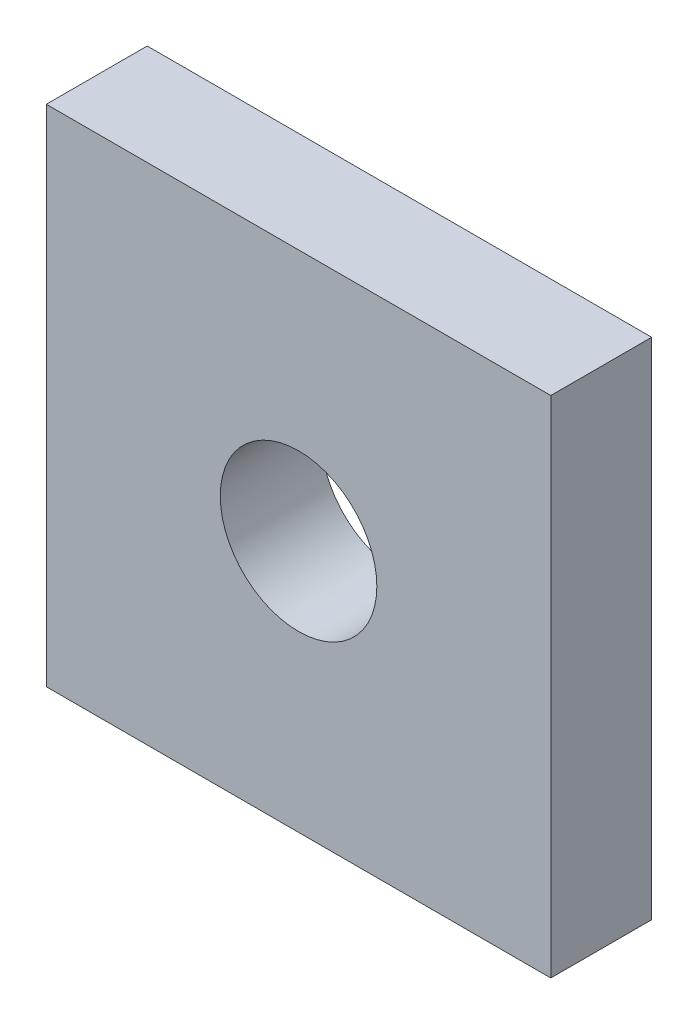
ISO-10303-21;
HEADER;
FILE_DESCRIPTION(('STEP AP214'),'2;1');
FILE_NAME('part.step','',(''),(''),'','','');
FILE_SCHEMA(('AUTOMOTIVE_DESIGN { 1 0 10303 214 1 1 1 1 }'));
ENDSEC;
DATA;
#1=APPLICATION_CONTEXT('core data for automotive mechanical design processes');
#2=APPLICATION_PROTOCOL_DEFINITION('international standard','automotive_design',2000,#1);
#3=PRODUCT_CONTEXT('',#1,'mechanical');
#4=PRODUCT('Part','Part','',(#3));
#5=PRODUCT_RELATED_PRODUCT_CATEGORY('part','',(#4));
#6=PRODUCT_DEFINITION_FORMATION('','',#4);
#7=PRODUCT_DEFINITION_CONTEXT('part definition',#1,'design');
#8=PRODUCT_DEFINITION('design','',#6,#7);
#9=PRODUCT_DEFINITION_SHAPE('','',#8);
#10=(LENGTH_UNIT() NAMED_UNIT(*) SI_UNIT(.MILLI.,.METRE.));
#11=(NAMED_UNIT(*) PLANE_ANGLE_UNIT() SI_UNIT($,.RADIAN.));
#12=(NAMED_UNIT(*) SI_UNIT($,.STERADIAN.) SOLID_ANGLE_UNIT());
#13=UNCERTAINTY_MEASURE_WITH_UNIT(LENGTH_MEASURE(1.E-05),#10,'distance_accuracy_value','');
#14=(GEOMETRIC_REPRESENTATION_CONTEXT(3) GLOBAL_UNCERTAINTY_ASSIGNED_CONTEXT((#13)) GLOBAL_UNIT_ASSIGNED_CONTEXT((#10,
#11,#12)) REPRESENTATION_CONTEXT('',''));
#15=CARTESIAN_POINT('',(0.,0.,0.));
#16=DIRECTION('',(0.,0.,1.));
#17=DIRECTION('',(1.,0.,0.));
#18=AXIS2_PLACEMENT_3D('',#15,#16,#17);
#19=CARTESIAN_POINT('',(-175.,-175.,70.));
#20=DIRECTION('',(1.,0.,0.));
#21=DIRECTION('',(0.,0.,-1.));
#22=AXIS2_PLACEMENT_3D('',#19,#20,#21);
#23=PLANE('',#22);
#24=DIRECTION('',(0.,-1.,0.));
#25=VECTOR('',#24,1.);
#26=CARTESIAN_POINT('',(-175.,-175.,0.));
#27=LINE('',#26,#25);
#28=CARTESIAN_POINT('',(-175.,175.,0.));
#29=VERTEX_POINT('',#28);
#30=CARTESIAN_POINT('',(-175.,-175.,0.));
#31=VERTEX_POINT('',#30);
#32=EDGE_CURVE('E119',#29,#31,#27,.T.);
#33=ORIENTED_EDGE('',*,*,#32,.T.);
#34=DIRECTION('',(0.,0.,-1.));
#35=VECTOR('',#34,1.);
#36=CARTESIAN_POINT('',(-175.,-175.,70.));
#37=LINE('',#36,#35);
#38=CARTESIAN_POINT('',(-175.,-175.,70.));
#39=VERTEX_POINT('',#38);
#40=EDGE_CURVE('E13',#39,#31,#37,.T.);
#41=ORIENTED_EDGE('',*,*,#40,.F.);
#42=DIRECTION('',(0.,-1.,0.));
#43=VECTOR('',#42,1.);
#44=CARTESIAN_POINT('',(-175.,-175.,70.));
#45=LINE('',#44,#43);
#46=CARTESIAN_POINT('',(-175.,175.,70.));
#47=VERTEX_POINT('',#46);
#48=EDGE_CURVE('E103',#47,#39,#45,.T.);
#49=ORIENTED_EDGE('',*,*,#48,.F.);
#50=DIRECTION('',(0.,0.,-1.));
#51=VECTOR('',#50,1.);
#52=CARTESIAN_POINT('',(-175.,175.,70.));
#53=LINE('',#52,#51);
#54=EDGE_CURVE('E115',#47,#29,#53,.T.);
#55=ORIENTED_EDGE('',*,*,#54,.T.);
#56=EDGE_LOOP('',(#33,#41,#49,#55));
#57=FACE_BOUND('',#56,.T.);
#58=ADVANCED_FACE('F51',(#57),#23,.F.);
#59=CARTESIAN_POINT('',(175.,-175.,70.));
#60=DIRECTION('',(0.,1.,0.));
#61=DIRECTION('',(-1.,0.,0.));
#62=AXIS2_PLACEMENT_3D('',#59,#60,#61);
#63=PLANE('',#62);
#64=DIRECTION('',(1.,0.,0.));
#65=VECTOR('',#64,1.);
#66=CARTESIAN_POINT('',(175.,-175.,0.));
#67=LINE('',#66,#65);
#68=CARTESIAN_POINT('',(175.,-175.,0.));
#69=VERTEX_POINT('',#68);
#70=EDGE_CURVE('E108',#31,#69,#67,.T.);
#71=ORIENTED_EDGE('',*,*,#70,.T.);
#72=DIRECTION('',(0.,0.,-1.));
#73=VECTOR('',#72,1.);
#74=CARTESIAN_POINT('',(175.,-175.,70.));
#75=LINE('',#74,#73);
#76=CARTESIAN_POINT('',(175.,-175.,70.));
#77=VERTEX_POINT('',#76);
#78=EDGE_CURVE('E60',#77,#69,#75,.T.);
#79=ORIENTED_EDGE('',*,*,#78,.F.);
#80=DIRECTION('',(1.,0.,0.));
#81=VECTOR('',#80,1.);
#82=CARTESIAN_POINT('',(175.,-175.,70.));
#83=LINE('',#82,#81);
#84=EDGE_CURVE('E98',#39,#77,#83,.T.);
#85=ORIENTED_EDGE('',*,*,#84,.F.);
#86=ORIENTED_EDGE('',*,*,#40,.T.);
#87=EDGE_LOOP('',(#71,#79,#85,#86));
#88=FACE_BOUND('',#87,.T.);
#89=ADVANCED_FACE('F107',(#88),#63,.F.);
#90=CARTESIAN_POINT('',(175.,-175.,70.));
#91=DIRECTION('',(-1.,0.,0.));
#92=DIRECTION('',(0.,0.,1.));
#93=AXIS2_PLACEMENT_3D('',#90,#91,#92);
#94=PLANE('',#93);
#95=DIRECTION('',(0.,1.,0.));
#96=VECTOR('',#95,1.);
#97=CARTESIAN_POINT('',(175.,-175.,0.));
#98=LINE('',#97,#96);
#99=CARTESIAN_POINT('',(175.,175.,0.));
#100=VERTEX_POINT('',#99);
#101=EDGE_CURVE('E85',#69,#100,#98,.T.);
#102=ORIENTED_EDGE('',*,*,#101,.T.);
#103=DIRECTION('',(0.,0.,-1.));
#104=VECTOR('',#103,1.);
#105=CARTESIAN_POINT('',(175.,175.,70.));
#106=LINE('',#105,#104);
#107=CARTESIAN_POINT('',(175.,175.,70.));
#108=VERTEX_POINT('',#107);
#109=EDGE_CURVE('E110',#108,#100,#106,.T.);
#110=ORIENTED_EDGE('',*,*,#109,.F.);
#111=DIRECTION('',(0.,1.,0.));
#112=VECTOR('',#111,1.);
#113=CARTESIAN_POINT('',(175.,-175.,70.));
#114=LINE('',#113,#112);
#115=EDGE_CURVE('E101',#77,#108,#114,.T.);
#116=ORIENTED_EDGE('',*,*,#115,.F.);
#117=ORIENTED_EDGE('',*,*,#78,.T.);
#118=EDGE_LOOP('',(#102,#110,#116,#117));
#119=FACE_BOUND('',#118,.T.);
#120=ADVANCED_FACE('F111',(#119),#94,.F.);
#121=CARTESIAN_POINT('',(175.,175.,70.));
#122=DIRECTION('',(0.,-1.,0.));
#123=DIRECTION('',(1.,0.,0.));
#124=AXIS2_PLACEMENT_3D('',#121,#122,#123);
#125=PLANE('',#124);
#126=DIRECTION('',(-1.,0.,0.));
#127=VECTOR('',#126,1.);
#128=CARTESIAN_POINT('',(175.,175.,0.));
#129=LINE('',#128,#127);
#130=EDGE_CURVE('E91',#100,#29,#129,.T.);
#131=ORIENTED_EDGE('',*,*,#130,.T.);
#132=ORIENTED_EDGE('',*,*,#54,.F.);
#133=DIRECTION('',(-1.,0.,0.));
#134=VECTOR('',#133,1.);
#135=CARTESIAN_POINT('',(175.,175.,70.));
#136=LINE('',#135,#134);
#137=EDGE_CURVE('E68',#108,#47,#136,.T.);
#138=ORIENTED_EDGE('',*,*,#137,.F.);
#139=ORIENTED_EDGE('',*,*,#109,.T.);
#140=EDGE_LOOP('',(#131,#132,#138,#139));
#141=FACE_BOUND('',#140,.T.);
#142=ADVANCED_FACE('F133',(#141),#125,.F.);
#143=CARTESIAN_POINT('',(0.,0.,70.));
#144=DIRECTION('',(0.,0.,1.));
#145=DIRECTION('',(1.,0.,0.));
#146=AXIS2_PLACEMENT_3D('',#143,#144,#145);
#147=PLANE('',#146);
#148=CARTESIAN_POINT('',(0.,0.,70.));
#149=DIRECTION('',(0.,0.,1.));
#150=DIRECTION('',(1.,0.,0.));
#151=AXIS2_PLACEMENT_3D('',#148,#149,#150);
#152=CIRCLE('',#151,54.315247482407);
#153=CARTESIAN_POINT('',(54.315247482407,0.,70.));
#154=VERTEX_POINT('',#153);
#155=EDGE_CURVE('E140',#154,#154,#152,.T.);
#156=ORIENTED_EDGE('',*,*,#155,.F.);
#157=EDGE_LOOP('',(#156));
#158=FACE_BOUND('',#157,.T.);
#159=ORIENTED_EDGE('',*,*,#48,.T.);
#160=ORIENTED_EDGE('',*,*,#84,.T.);
#161=ORIENTED_EDGE('',*,*,#115,.T.);
#162=ORIENTED_EDGE('',*,*,#137,.T.);
#163=EDGE_LOOP('',(#159,#160,#161,#162));
#164=FACE_BOUND('',#163,.T.);
#165=ADVANCED_FACE('F99',(#158,#164),#147,.T.);
#166=CARTESIAN_POINT('',(0.,0.,0.));
#167=DIRECTION('',(0.,0.,1.));
#168=DIRECTION('',(1.,0.,0.));
#169=AXIS2_PLACEMENT_3D('',#166,#167,#168);
#170=PLANE('',#169);
#171=CARTESIAN_POINT('',(0.,0.,0.));
#172=DIRECTION('',(0.,0.,1.));
#173=DIRECTION('',(1.,0.,0.));
#174=AXIS2_PLACEMENT_3D('',#171,#172,#173);
#175=CIRCLE('',#174,54.315247482407);
#176=CARTESIAN_POINT('',(54.315247482407,0.,0.));
#177=VERTEX_POINT('',#176);
#178=EDGE_CURVE('E123',#177,#177,#175,.T.);
#179=ORIENTED_EDGE('',*,*,#178,.T.);
#180=EDGE_LOOP('',(#179));
#181=FACE_BOUND('',#180,.T.);
#182=ORIENTED_EDGE('',*,*,#32,.F.);
#183=ORIENTED_EDGE('',*,*,#130,.F.);
#184=ORIENTED_EDGE('',*,*,#101,.F.);
#185=ORIENTED_EDGE('',*,*,#70,.F.);
#186=EDGE_LOOP('',(#182,#183,#184,#185));
#187=FACE_BOUND('',#186,.T.);
#188=ADVANCED_FACE('F136',(#181,#187),#170,.F.);
#189=CARTESIAN_POINT('',(0.,0.,0.));
#190=DIRECTION('',(0.,0.,1.));
#191=DIRECTION('',(1.,0.,0.));
#192=AXIS2_PLACEMENT_3D('',#189,#190,#191);
#193=CYLINDRICAL_SURFACE('',#192,54.315247482407);
#194=ORIENTED_EDGE('',*,*,#178,.F.);
#195=EDGE_LOOP('',(#194));
#196=FACE_BOUND('',#195,.T.);
#197=ORIENTED_EDGE('',*,*,#155,.T.);
#198=EDGE_LOOP('',(#197));
#199=FACE_BOUND('',#198,.T.);
#200=ADVANCED_FACE('F149',(#196,#199),#193,.F.);
#201=CLOSED_SHELL('',(#58,#89,#120,#142,#165,#188,#200));
#202=MANIFOLD_SOLID_BREP('B2',#201);
#203=ADVANCED_BREP_SHAPE_REPRESENTATION('',(#18,#202),#14);
#204=SHAPE_DEFINITION_REPRESENTATION(#9,#203);
ENDSEC;
END-ISO-10303-21;
